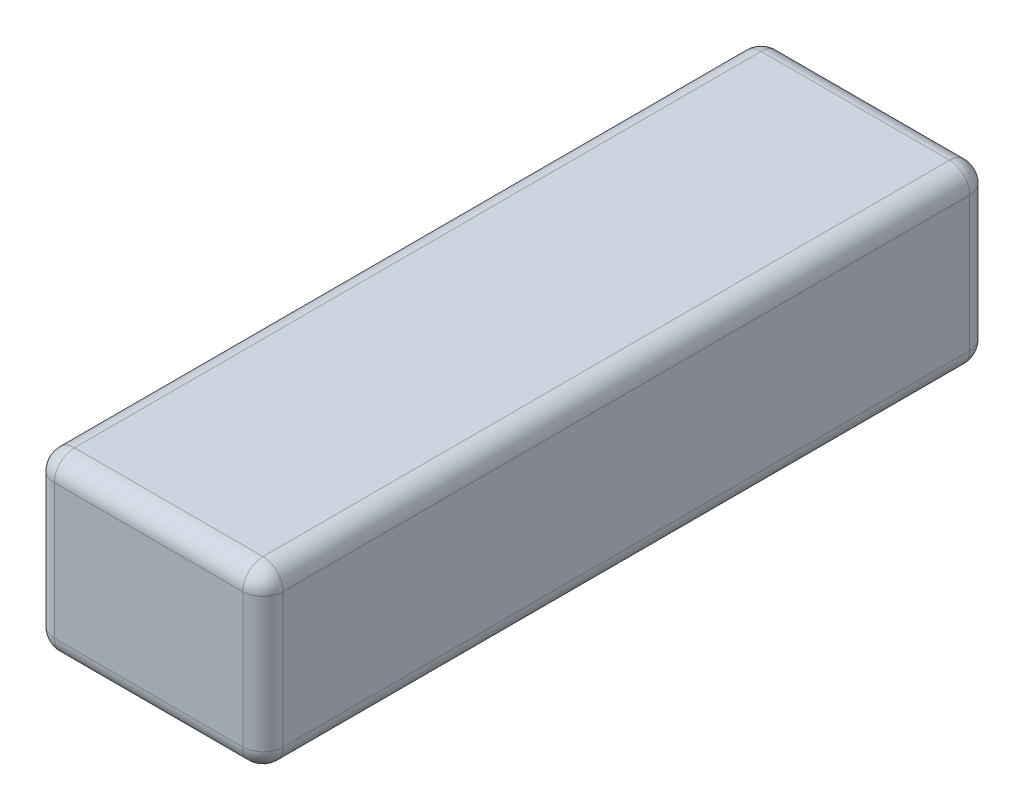
ISO-10303-21;
HEADER;
FILE_DESCRIPTION(('STEP AP214'),'2;1');
FILE_NAME('part.step','',(''),(''),'','','');
FILE_SCHEMA(('AUTOMOTIVE_DESIGN { 1 0 10303 214 1 1 1 1 }'));
ENDSEC;
DATA;
#1=APPLICATION_CONTEXT('core data for automotive mechanical design processes');
#2=APPLICATION_PROTOCOL_DEFINITION('international standard','automotive_design',2000,#1);
#3=PRODUCT_CONTEXT('',#1,'mechanical');
#4=PRODUCT('Part','Part','',(#3));
#5=PRODUCT_RELATED_PRODUCT_CATEGORY('part','',(#4));
#6=PRODUCT_DEFINITION_FORMATION('','',#4);
#7=PRODUCT_DEFINITION_CONTEXT('part definition',#1,'design');
#8=PRODUCT_DEFINITION('design','',#6,#7);
#9=PRODUCT_DEFINITION_SHAPE('','',#8);
#10=(LENGTH_UNIT() NAMED_UNIT(*) SI_UNIT(.MILLI.,.METRE.));
#11=(NAMED_UNIT(*) PLANE_ANGLE_UNIT() SI_UNIT($,.RADIAN.));
#12=(NAMED_UNIT(*) SI_UNIT($,.STERADIAN.) SOLID_ANGLE_UNIT());
#13=UNCERTAINTY_MEASURE_WITH_UNIT(LENGTH_MEASURE(1.E-05),#10,'distance_accuracy_value','');
#14=(GEOMETRIC_REPRESENTATION_CONTEXT(3) GLOBAL_UNCERTAINTY_ASSIGNED_CONTEXT((#13)) GLOBAL_UNIT_ASSIGNED_CONTEXT((#10,
#11,#12)) REPRESENTATION_CONTEXT('',''));
#15=CARTESIAN_POINT('',(0.,0.,0.));
#16=DIRECTION('',(0.,0.,1.));
#17=DIRECTION('',(1.,0.,0.));
#18=AXIS2_PLACEMENT_3D('',#15,#16,#17);
#19=CARTESIAN_POINT('',(17.,9.99999999999999,-51.));
#20=DIRECTION('',(-1.,0.,0.));
#21=DIRECTION('',(0.,0.,1.));
#22=AXIS2_PLACEMENT_3D('',#19,#20,#21);
#23=CYLINDRICAL_SURFACE('',#22,3.);
#24=DIRECTION('',(-1.,0.,0.));
#25=VECTOR('',#24,1.);
#26=CARTESIAN_POINT('',(17.,9.99999999999999,-54.));
#27=LINE('',#26,#25);
#28=CARTESIAN_POINT('',(14.,9.99999999999999,-54.));
#29=VERTEX_POINT('',#28);
#30=CARTESIAN_POINT('',(-14.,9.99999999999999,-54.));
#31=VERTEX_POINT('',#30);
#32=EDGE_CURVE('E227',#29,#31,#27,.T.);
#33=ORIENTED_EDGE('',*,*,#32,.T.);
#34=CARTESIAN_POINT('',(-14.,9.99999999999999,-51.));
#35=DIRECTION('',(-1.,0.,0.));
#36=DIRECTION('',(0.,0.,1.));
#37=AXIS2_PLACEMENT_3D('',#34,#35,#36);
#38=CIRCLE('',#37,3.);
#39=CARTESIAN_POINT('',(-14.,13.,-51.));
#40=VERTEX_POINT('',#39);
#41=EDGE_CURVE('E199',#31,#40,#38,.F.);
#42=ORIENTED_EDGE('',*,*,#41,.T.);
#43=DIRECTION('',(-1.,0.,0.));
#44=VECTOR('',#43,1.);
#45=CARTESIAN_POINT('',(17.,13.,-51.));
#46=LINE('',#45,#44);
#47=CARTESIAN_POINT('',(14.,13.,-51.));
#48=VERTEX_POINT('',#47);
#49=EDGE_CURVE('E147',#48,#40,#46,.T.);
#50=ORIENTED_EDGE('',*,*,#49,.F.);
#51=CARTESIAN_POINT('',(14.,9.99999999999999,-51.));
#52=DIRECTION('',(-1.,0.,0.));
#53=DIRECTION('',(0.,0.,1.));
#54=AXIS2_PLACEMENT_3D('',#51,#52,#53);
#55=CIRCLE('',#54,3.);
#56=EDGE_CURVE('E197',#48,#29,#55,.T.);
#57=ORIENTED_EDGE('',*,*,#56,.T.);
#58=EDGE_LOOP('',(#33,#42,#50,#57));
#59=FACE_BOUND('',#58,.T.);
#60=ADVANCED_FACE('F35',(#59),#23,.T.);
#61=CARTESIAN_POINT('',(17.,13.,51.));
#62=DIRECTION('',(0.,-1.,0.));
#63=DIRECTION('',(0.,0.,-1.));
#64=AXIS2_PLACEMENT_3D('',#61,#62,#63);
#65=PLANE('',#64);
#66=ORIENTED_EDGE('',*,*,#49,.T.);
#67=DIRECTION('',(0.,0.,1.));
#68=VECTOR('',#67,1.);
#69=CARTESIAN_POINT('',(-14.,13.,51.));
#70=LINE('',#69,#68);
#71=CARTESIAN_POINT('',(-14.,13.,51.));
#72=VERTEX_POINT('',#71);
#73=EDGE_CURVE('E146',#40,#72,#70,.T.);
#74=ORIENTED_EDGE('',*,*,#73,.T.);
#75=DIRECTION('',(-1.,0.,0.));
#76=VECTOR('',#75,1.);
#77=CARTESIAN_POINT('',(17.,13.,51.));
#78=LINE('',#77,#76);
#79=CARTESIAN_POINT('',(14.,13.,51.));
#80=VERTEX_POINT('',#79);
#81=EDGE_CURVE('E128',#80,#72,#78,.T.);
#82=ORIENTED_EDGE('',*,*,#81,.F.);
#83=DIRECTION('',(0.,0.,1.));
#84=VECTOR('',#83,1.);
#85=CARTESIAN_POINT('',(14.,13.,51.));
#86=LINE('',#85,#84);
#87=EDGE_CURVE('E143',#80,#48,#86,.F.);
#88=ORIENTED_EDGE('',*,*,#87,.T.);
#89=EDGE_LOOP('',(#66,#74,#82,#88));
#90=FACE_BOUND('',#89,.T.);
#91=ADVANCED_FACE('F141',(#90),#65,.F.);
#92=CARTESIAN_POINT('',(17.,9.99999999999999,51.));
#93=DIRECTION('',(-1.,0.,0.));
#94=DIRECTION('',(0.,0.,1.));
#95=AXIS2_PLACEMENT_3D('',#92,#93,#94);
#96=CYLINDRICAL_SURFACE('',#95,3.);
#97=ORIENTED_EDGE('',*,*,#81,.T.);
#98=CARTESIAN_POINT('',(-14.,9.99999999999999,51.));
#99=DIRECTION('',(-1.,0.,0.));
#100=DIRECTION('',(0.,0.,1.));
#101=AXIS2_PLACEMENT_3D('',#98,#99,#100);
#102=CIRCLE('',#101,3.);
#103=CARTESIAN_POINT('',(-14.,9.99999999999999,54.));
#104=VERTEX_POINT('',#103);
#105=EDGE_CURVE('E135',#72,#104,#102,.F.);
#106=ORIENTED_EDGE('',*,*,#105,.T.);
#107=DIRECTION('',(-1.,0.,0.));
#108=VECTOR('',#107,1.);
#109=CARTESIAN_POINT('',(17.,9.99999999999999,54.));
#110=LINE('',#109,#108);
#111=CARTESIAN_POINT('',(14.,9.99999999999999,54.));
#112=VERTEX_POINT('',#111);
#113=EDGE_CURVE('E130',#112,#104,#110,.T.);
#114=ORIENTED_EDGE('',*,*,#113,.F.);
#115=CARTESIAN_POINT('',(14.,9.99999999999999,51.));
#116=DIRECTION('',(-1.,0.,0.));
#117=DIRECTION('',(0.,0.,1.));
#118=AXIS2_PLACEMENT_3D('',#115,#116,#117);
#119=CIRCLE('',#118,3.);
#120=EDGE_CURVE('E125',#112,#80,#119,.T.);
#121=ORIENTED_EDGE('',*,*,#120,.T.);
#122=EDGE_LOOP('',(#97,#106,#114,#121));
#123=FACE_BOUND('',#122,.T.);
#124=ADVANCED_FACE('F127',(#123),#96,.T.);
#125=CARTESIAN_POINT('',(17.,9.99999999999999,54.));
#126=DIRECTION('',(0.,0.,-1.));
#127=DIRECTION('',(0.,1.,0.));
#128=AXIS2_PLACEMENT_3D('',#125,#126,#127);
#129=PLANE('',#128);
#130=ORIENTED_EDGE('',*,*,#113,.T.);
#131=DIRECTION('',(0.,-1.,0.));
#132=VECTOR('',#131,1.);
#133=CARTESIAN_POINT('',(-14.,-10.,54.));
#134=LINE('',#133,#132);
#135=CARTESIAN_POINT('',(-14.,-10.,54.));
#136=VERTEX_POINT('',#135);
#137=EDGE_CURVE('E178',#104,#136,#134,.T.);
#138=ORIENTED_EDGE('',*,*,#137,.T.);
#139=DIRECTION('',(-1.,0.,0.));
#140=VECTOR('',#139,1.);
#141=CARTESIAN_POINT('',(17.,-10.,54.));
#142=LINE('',#141,#140);
#143=CARTESIAN_POINT('',(14.,-10.,54.));
#144=VERTEX_POINT('',#143);
#145=EDGE_CURVE('E248',#144,#136,#142,.T.);
#146=ORIENTED_EDGE('',*,*,#145,.F.);
#147=DIRECTION('',(0.,-1.,0.));
#148=VECTOR('',#147,1.);
#149=CARTESIAN_POINT('',(14.,9.99999999999999,54.));
#150=LINE('',#149,#148);
#151=EDGE_CURVE('E176',#144,#112,#150,.F.);
#152=ORIENTED_EDGE('',*,*,#151,.T.);
#153=EDGE_LOOP('',(#130,#138,#146,#152));
#154=FACE_BOUND('',#153,.T.);
#155=ADVANCED_FACE('F245',(#154),#129,.F.);
#156=CARTESIAN_POINT('',(17.,-10.,51.));
#157=DIRECTION('',(-1.,0.,0.));
#158=DIRECTION('',(0.,0.,1.));
#159=AXIS2_PLACEMENT_3D('',#156,#157,#158);
#160=CYLINDRICAL_SURFACE('',#159,3.);
#161=ORIENTED_EDGE('',*,*,#145,.T.);
#162=CARTESIAN_POINT('',(-14.,-10.,51.));
#163=DIRECTION('',(-1.,0.,0.));
#164=DIRECTION('',(0.,0.,1.));
#165=AXIS2_PLACEMENT_3D('',#162,#163,#164);
#166=CIRCLE('',#165,3.);
#167=CARTESIAN_POINT('',(-14.,-13.,51.));
#168=VERTEX_POINT('',#167);
#169=EDGE_CURVE('E182',#136,#168,#166,.F.);
#170=ORIENTED_EDGE('',*,*,#169,.T.);
#171=DIRECTION('',(-1.,0.,0.));
#172=VECTOR('',#171,1.);
#173=CARTESIAN_POINT('',(17.,-13.,51.));
#174=LINE('',#173,#172);
#175=CARTESIAN_POINT('',(14.,-13.,51.));
#176=VERTEX_POINT('',#175);
#177=EDGE_CURVE('E251',#176,#168,#174,.T.);
#178=ORIENTED_EDGE('',*,*,#177,.F.);
#179=CARTESIAN_POINT('',(14.,-10.,51.));
#180=DIRECTION('',(-1.,0.,0.));
#181=DIRECTION('',(0.,0.,1.));
#182=AXIS2_PLACEMENT_3D('',#179,#180,#181);
#183=CIRCLE('',#182,3.);
#184=EDGE_CURVE('E180',#176,#144,#183,.T.);
#185=ORIENTED_EDGE('',*,*,#184,.T.);
#186=EDGE_LOOP('',(#161,#170,#178,#185));
#187=FACE_BOUND('',#186,.T.);
#188=ADVANCED_FACE('F293',(#187),#160,.T.);
#189=CARTESIAN_POINT('',(17.,-13.,51.));
#190=DIRECTION('',(0.,1.,0.));
#191=DIRECTION('',(0.,0.,1.));
#192=AXIS2_PLACEMENT_3D('',#189,#190,#191);
#193=PLANE('',#192);
#194=ORIENTED_EDGE('',*,*,#177,.T.);
#195=DIRECTION('',(0.,0.,-1.));
#196=VECTOR('',#195,1.);
#197=CARTESIAN_POINT('',(-14.,-13.,-51.));
#198=LINE('',#197,#196);
#199=CARTESIAN_POINT('',(-14.,-13.,-51.));
#200=VERTEX_POINT('',#199);
#201=EDGE_CURVE('E186',#168,#200,#198,.T.);
#202=ORIENTED_EDGE('',*,*,#201,.T.);
#203=DIRECTION('',(-1.,0.,0.));
#204=VECTOR('',#203,1.);
#205=CARTESIAN_POINT('',(17.,-13.,-51.));
#206=LINE('',#205,#204);
#207=CARTESIAN_POINT('',(14.,-13.,-51.));
#208=VERTEX_POINT('',#207);
#209=EDGE_CURVE('E255',#208,#200,#206,.T.);
#210=ORIENTED_EDGE('',*,*,#209,.F.);
#211=DIRECTION('',(0.,0.,-1.));
#212=VECTOR('',#211,1.);
#213=CARTESIAN_POINT('',(14.,-13.,51.));
#214=LINE('',#213,#212);
#215=EDGE_CURVE('E184',#208,#176,#214,.F.);
#216=ORIENTED_EDGE('',*,*,#215,.T.);
#217=EDGE_LOOP('',(#194,#202,#210,#216));
#218=FACE_BOUND('',#217,.T.);
#219=ADVANCED_FACE('F296',(#218),#193,.F.);
#220=CARTESIAN_POINT('',(17.,-10.,-51.));
#221=DIRECTION('',(-1.,0.,0.));
#222=DIRECTION('',(0.,0.,1.));
#223=AXIS2_PLACEMENT_3D('',#220,#221,#222);
#224=CYLINDRICAL_SURFACE('',#223,3.);
#225=ORIENTED_EDGE('',*,*,#209,.T.);
#226=CARTESIAN_POINT('',(-14.,-10.,-51.));
#227=DIRECTION('',(-1.,0.,0.));
#228=DIRECTION('',(0.,0.,1.));
#229=AXIS2_PLACEMENT_3D('',#226,#227,#228);
#230=CIRCLE('',#229,3.);
#231=CARTESIAN_POINT('',(-14.,-10.,-54.));
#232=VERTEX_POINT('',#231);
#233=EDGE_CURVE('E190',#200,#232,#230,.F.);
#234=ORIENTED_EDGE('',*,*,#233,.T.);
#235=DIRECTION('',(-1.,0.,0.));
#236=VECTOR('',#235,1.);
#237=CARTESIAN_POINT('',(17.,-10.,-54.));
#238=LINE('',#237,#236);
#239=CARTESIAN_POINT('',(14.,-10.,-54.));
#240=VERTEX_POINT('',#239);
#241=EDGE_CURVE('E260',#240,#232,#238,.T.);
#242=ORIENTED_EDGE('',*,*,#241,.F.);
#243=CARTESIAN_POINT('',(14.,-10.,-51.));
#244=DIRECTION('',(-1.,0.,0.));
#245=DIRECTION('',(0.,0.,1.));
#246=AXIS2_PLACEMENT_3D('',#243,#244,#245);
#247=CIRCLE('',#246,3.);
#248=EDGE_CURVE('E188',#240,#208,#247,.T.);
#249=ORIENTED_EDGE('',*,*,#248,.T.);
#250=EDGE_LOOP('',(#225,#234,#242,#249));
#251=FACE_BOUND('',#250,.T.);
#252=ADVANCED_FACE('F309',(#251),#224,.T.);
#253=CARTESIAN_POINT('',(17.,9.99999999999999,-54.));
#254=DIRECTION('',(0.,0.,1.));
#255=DIRECTION('',(0.,-1.,0.));
#256=AXIS2_PLACEMENT_3D('',#253,#254,#255);
#257=PLANE('',#256);
#258=ORIENTED_EDGE('',*,*,#241,.T.);
#259=DIRECTION('',(0.,1.,0.));
#260=VECTOR('',#259,1.);
#261=CARTESIAN_POINT('',(-14.,9.99999999999999,-54.));
#262=LINE('',#261,#260);
#263=EDGE_CURVE('E195',#232,#31,#262,.T.);
#264=ORIENTED_EDGE('',*,*,#263,.T.);
#265=ORIENTED_EDGE('',*,*,#32,.F.);
#266=DIRECTION('',(0.,1.,0.));
#267=VECTOR('',#266,1.);
#268=CARTESIAN_POINT('',(14.,9.99999999999999,-54.));
#269=LINE('',#268,#267);
#270=EDGE_CURVE('E192',#29,#240,#269,.F.);
#271=ORIENTED_EDGE('',*,*,#270,.T.);
#272=EDGE_LOOP('',(#258,#264,#265,#271));
#273=FACE_BOUND('',#272,.T.);
#274=ADVANCED_FACE('F310',(#273),#257,.F.);
#275=CARTESIAN_POINT('',(17.,9.99999999999999,-51.));
#276=DIRECTION('',(-1.,0.,0.));
#277=DIRECTION('',(0.,0.,1.));
#278=AXIS2_PLACEMENT_3D('',#275,#276,#277);
#279=PLANE('',#278);
#280=DIRECTION('',(0.,0.,-1.));
#281=VECTOR('',#280,1.);
#282=CARTESIAN_POINT('',(17.,-10.,-51.));
#283=LINE('',#282,#281);
#284=CARTESIAN_POINT('',(17.,-10.,51.));
#285=VERTEX_POINT('',#284);
#286=CARTESIAN_POINT('',(17.,-10.,-51.));
#287=VERTEX_POINT('',#286);
#288=EDGE_CURVE('E44',#285,#287,#283,.T.);
#289=ORIENTED_EDGE('',*,*,#288,.T.);
#290=DIRECTION('',(0.,1.,0.));
#291=VECTOR('',#290,1.);
#292=CARTESIAN_POINT('',(17.,9.99999999999999,-51.));
#293=LINE('',#292,#291);
#294=CARTESIAN_POINT('',(17.,9.99999999999999,-51.));
#295=VERTEX_POINT('',#294);
#296=EDGE_CURVE('E11',#287,#295,#293,.T.);
#297=ORIENTED_EDGE('',*,*,#296,.T.);
#298=DIRECTION('',(0.,0.,1.));
#299=VECTOR('',#298,1.);
#300=CARTESIAN_POINT('',(17.,9.99999999999999,-51.));
#301=LINE('',#300,#299);
#302=CARTESIAN_POINT('',(17.,9.99999999999999,51.));
#303=VERTEX_POINT('',#302);
#304=EDGE_CURVE('E201',#295,#303,#301,.T.);
#305=ORIENTED_EDGE('',*,*,#304,.T.);
#306=DIRECTION('',(0.,-1.,0.));
#307=VECTOR('',#306,1.);
#308=CARTESIAN_POINT('',(17.,9.99999999999996,51.));
#309=LINE('',#308,#307);
#310=EDGE_CURVE('E55',#303,#285,#309,.T.);
#311=ORIENTED_EDGE('',*,*,#310,.T.);
#312=EDGE_LOOP('',(#289,#297,#305,#311));
#313=FACE_BOUND('',#312,.T.);
#314=ADVANCED_FACE('F319',(#313),#279,.F.);
#315=CARTESIAN_POINT('',(-17.,9.99999999999999,-51.));
#316=DIRECTION('',(-1.,0.,0.));
#317=DIRECTION('',(0.,0.,1.));
#318=AXIS2_PLACEMENT_3D('',#315,#316,#317);
#319=PLANE('',#318);
#320=DIRECTION('',(0.,-1.,0.));
#321=VECTOR('',#320,1.);
#322=CARTESIAN_POINT('',(-17.,9.99999999999999,51.));
#323=LINE('',#322,#321);
#324=CARTESIAN_POINT('',(-17.,-10.,51.));
#325=VERTEX_POINT('',#324);
#326=CARTESIAN_POINT('',(-17.,9.99999999999999,51.));
#327=VERTEX_POINT('',#326);
#328=EDGE_CURVE('E171',#325,#327,#323,.F.);
#329=ORIENTED_EDGE('',*,*,#328,.T.);
#330=DIRECTION('',(0.,0.,1.));
#331=VECTOR('',#330,1.);
#332=CARTESIAN_POINT('',(-17.,9.99999999999999,-51.));
#333=LINE('',#332,#331);
#334=CARTESIAN_POINT('',(-17.,9.99999999999999,-51.));
#335=VERTEX_POINT('',#334);
#336=EDGE_CURVE('E136',#327,#335,#333,.F.);
#337=ORIENTED_EDGE('',*,*,#336,.T.);
#338=DIRECTION('',(0.,1.,0.));
#339=VECTOR('',#338,1.);
#340=CARTESIAN_POINT('',(-17.,-10.,-51.));
#341=LINE('',#340,#339);
#342=CARTESIAN_POINT('',(-17.,-10.,-51.));
#343=VERTEX_POINT('',#342);
#344=EDGE_CURVE('E164',#335,#343,#341,.F.);
#345=ORIENTED_EDGE('',*,*,#344,.T.);
#346=DIRECTION('',(0.,0.,-1.));
#347=VECTOR('',#346,1.);
#348=CARTESIAN_POINT('',(-17.,-10.,51.));
#349=LINE('',#348,#347);
#350=EDGE_CURVE('E169',#343,#325,#349,.F.);
#351=ORIENTED_EDGE('',*,*,#350,.T.);
#352=EDGE_LOOP('',(#329,#337,#345,#351));
#353=FACE_BOUND('',#352,.T.);
#354=ADVANCED_FACE('F321',(#353),#319,.T.);
#355=CARTESIAN_POINT('',(-14.,-10.,51.));
#356=DIRECTION('',(0.,0.,1.));
#357=DIRECTION('',(1.,0.,0.));
#358=AXIS2_PLACEMENT_3D('',#355,#356,#357);
#359=CYLINDRICAL_SURFACE('',#358,3.);
#360=CARTESIAN_POINT('',(-14.,-10.,-51.));
#361=DIRECTION('',(0.,0.,-1.));
#362=DIRECTION('',(-1.,0.,0.));
#363=AXIS2_PLACEMENT_3D('',#360,#361,#362);
#364=CIRCLE('',#363,3.);
#365=EDGE_CURVE('E224',#200,#343,#364,.T.);
#366=ORIENTED_EDGE('',*,*,#365,.F.);
#367=ORIENTED_EDGE('',*,*,#201,.F.);
#368=CARTESIAN_POINT('',(-14.,-10.,51.));
#369=DIRECTION('',(0.,0.,1.));
#370=DIRECTION('',(1.,0.,0.));
#371=AXIS2_PLACEMENT_3D('',#368,#369,#370);
#372=CIRCLE('',#371,3.);
#373=EDGE_CURVE('E221',#325,#168,#372,.T.);
#374=ORIENTED_EDGE('',*,*,#373,.F.);
#375=ORIENTED_EDGE('',*,*,#350,.F.);
#376=EDGE_LOOP('',(#366,#367,#374,#375));
#377=FACE_BOUND('',#376,.T.);
#378=ADVANCED_FACE('F301',(#377),#359,.T.);
#379=CARTESIAN_POINT('',(-14.,-10.,-51.));
#380=DIRECTION('',(0.,0.,1.));
#381=DIRECTION('',(1.,0.,0.));
#382=AXIS2_PLACEMENT_3D('',#379,#380,#381);
#383=SPHERICAL_SURFACE('',#382,3.);
#384=ORIENTED_EDGE('',*,*,#233,.F.);
#385=ORIENTED_EDGE('',*,*,#365,.T.);
#386=CARTESIAN_POINT('',(-14.,-10.,-51.));
#387=DIRECTION('',(0.,1.,0.));
#388=DIRECTION('',(0.,0.,1.));
#389=AXIS2_PLACEMENT_3D('',#386,#387,#388);
#390=CIRCLE('',#389,3.);
#391=EDGE_CURVE('E218',#232,#343,#390,.T.);
#392=ORIENTED_EDGE('',*,*,#391,.F.);
#393=EDGE_LOOP('',(#384,#385,#392));
#394=FACE_BOUND('',#393,.T.);
#395=ADVANCED_FACE('F306',(#394),#383,.T.);
#396=CARTESIAN_POINT('',(-14.,-10.,51.));
#397=DIRECTION('',(0.,0.,1.));
#398=DIRECTION('',(1.,0.,0.));
#399=AXIS2_PLACEMENT_3D('',#396,#397,#398);
#400=SPHERICAL_SURFACE('',#399,3.);
#401=ORIENTED_EDGE('',*,*,#373,.T.);
#402=ORIENTED_EDGE('',*,*,#169,.F.);
#403=CARTESIAN_POINT('',(-14.,-10.,51.));
#404=DIRECTION('',(0.,1.,0.));
#405=DIRECTION('',(0.,0.,1.));
#406=AXIS2_PLACEMENT_3D('',#403,#404,#405);
#407=CIRCLE('',#406,3.);
#408=EDGE_CURVE('E215',#325,#136,#407,.T.);
#409=ORIENTED_EDGE('',*,*,#408,.F.);
#410=EDGE_LOOP('',(#401,#402,#409));
#411=FACE_BOUND('',#410,.T.);
#412=ADVANCED_FACE('F290',(#411),#400,.T.);
#413=CARTESIAN_POINT('',(-14.,9.99999999999999,-51.));
#414=DIRECTION('',(0.,-1.,0.));
#415=DIRECTION('',(0.,0.,-1.));
#416=AXIS2_PLACEMENT_3D('',#413,#414,#415);
#417=CYLINDRICAL_SURFACE('',#416,3.);
#418=ORIENTED_EDGE('',*,*,#391,.T.);
#419=ORIENTED_EDGE('',*,*,#344,.F.);
#420=CARTESIAN_POINT('',(-14.,9.99999999999999,-51.));
#421=DIRECTION('',(0.,1.,0.));
#422=DIRECTION('',(0.,0.,1.));
#423=AXIS2_PLACEMENT_3D('',#420,#421,#422);
#424=CIRCLE('',#423,3.);
#425=EDGE_CURVE('E212',#31,#335,#424,.T.);
#426=ORIENTED_EDGE('',*,*,#425,.F.);
#427=ORIENTED_EDGE('',*,*,#263,.F.);
#428=EDGE_LOOP('',(#418,#419,#426,#427));
#429=FACE_BOUND('',#428,.T.);
#430=ADVANCED_FACE('F273',(#429),#417,.T.);
#431=CARTESIAN_POINT('',(-14.,9.99999999999999,51.));
#432=DIRECTION('',(0.,1.,0.));
#433=DIRECTION('',(0.,0.,1.));
#434=AXIS2_PLACEMENT_3D('',#431,#432,#433);
#435=CYLINDRICAL_SURFACE('',#434,3.);
#436=ORIENTED_EDGE('',*,*,#408,.T.);
#437=ORIENTED_EDGE('',*,*,#137,.F.);
#438=CARTESIAN_POINT('',(-14.,9.99999999999999,51.));
#439=DIRECTION('',(0.,1.,0.));
#440=DIRECTION('',(0.,0.,1.));
#441=AXIS2_PLACEMENT_3D('',#438,#439,#440);
#442=CIRCLE('',#441,3.);
#443=EDGE_CURVE('E209',#327,#104,#442,.T.);
#444=ORIENTED_EDGE('',*,*,#443,.F.);
#445=ORIENTED_EDGE('',*,*,#328,.F.);
#446=EDGE_LOOP('',(#436,#437,#444,#445));
#447=FACE_BOUND('',#446,.T.);
#448=ADVANCED_FACE('F287',(#447),#435,.T.);
#449=CARTESIAN_POINT('',(-14.,9.99999999999999,-51.));
#450=DIRECTION('',(0.,0.,1.));
#451=DIRECTION('',(1.,0.,0.));
#452=AXIS2_PLACEMENT_3D('',#449,#450,#451);
#453=SPHERICAL_SURFACE('',#452,3.);
#454=ORIENTED_EDGE('',*,*,#41,.F.);
#455=ORIENTED_EDGE('',*,*,#425,.T.);
#456=CARTESIAN_POINT('',(-14.,9.99999999999999,-51.));
#457=DIRECTION('',(0.,0.,1.));
#458=DIRECTION('',(1.,0.,0.));
#459=AXIS2_PLACEMENT_3D('',#456,#457,#458);
#460=CIRCLE('',#459,3.);
#461=EDGE_CURVE('E207',#40,#335,#460,.T.);
#462=ORIENTED_EDGE('',*,*,#461,.F.);
#463=EDGE_LOOP('',(#454,#455,#462));
#464=FACE_BOUND('',#463,.T.);
#465=ADVANCED_FACE('F276',(#464),#453,.T.);
#466=CARTESIAN_POINT('',(-14.,9.99999999999999,51.));
#467=DIRECTION('',(0.,0.,1.));
#468=DIRECTION('',(1.,0.,0.));
#469=AXIS2_PLACEMENT_3D('',#466,#467,#468);
#470=SPHERICAL_SURFACE('',#469,3.);
#471=ORIENTED_EDGE('',*,*,#443,.T.);
#472=ORIENTED_EDGE('',*,*,#105,.F.);
#473=CARTESIAN_POINT('',(-14.,9.99999999999999,51.));
#474=DIRECTION('',(0.,0.,-1.));
#475=DIRECTION('',(-1.,0.,0.));
#476=AXIS2_PLACEMENT_3D('',#473,#474,#475);
#477=CIRCLE('',#476,3.);
#478=EDGE_CURVE('E205',#327,#72,#477,.T.);
#479=ORIENTED_EDGE('',*,*,#478,.F.);
#480=EDGE_LOOP('',(#471,#472,#479));
#481=FACE_BOUND('',#480,.T.);
#482=ADVANCED_FACE('F283',(#481),#470,.T.);
#483=CARTESIAN_POINT('',(-14.,9.99999999999999,51.));
#484=DIRECTION('',(0.,0.,-1.));
#485=DIRECTION('',(-1.,0.,0.));
#486=AXIS2_PLACEMENT_3D('',#483,#484,#485);
#487=CYLINDRICAL_SURFACE('',#486,3.);
#488=ORIENTED_EDGE('',*,*,#461,.T.);
#489=ORIENTED_EDGE('',*,*,#336,.F.);
#490=ORIENTED_EDGE('',*,*,#478,.T.);
#491=ORIENTED_EDGE('',*,*,#73,.F.);
#492=EDGE_LOOP('',(#488,#489,#490,#491));
#493=FACE_BOUND('',#492,.T.);
#494=ADVANCED_FACE('F279',(#493),#487,.T.);
#495=CARTESIAN_POINT('',(14.,9.99999999999996,51.));
#496=DIRECTION('',(0.,-1.,0.));
#497=DIRECTION('',(0.,0.,-1.));
#498=AXIS2_PLACEMENT_3D('',#495,#496,#497);
#499=CYLINDRICAL_SURFACE('',#498,3.);
#500=CARTESIAN_POINT('',(14.,9.99999999999999,51.));
#501=DIRECTION('',(0.,1.,0.));
#502=DIRECTION('',(0.,0.,1.));
#503=AXIS2_PLACEMENT_3D('',#500,#501,#502);
#504=CIRCLE('',#503,3.);
#505=EDGE_CURVE('E152',#112,#303,#504,.T.);
#506=ORIENTED_EDGE('',*,*,#505,.F.);
#507=ORIENTED_EDGE('',*,*,#151,.F.);
#508=CARTESIAN_POINT('',(14.,-10.,51.));
#509=DIRECTION('',(0.,-1.,0.));
#510=DIRECTION('',(0.,0.,-1.));
#511=AXIS2_PLACEMENT_3D('',#508,#509,#510);
#512=CIRCLE('',#511,3.);
#513=EDGE_CURVE('E39',#285,#144,#512,.T.);
#514=ORIENTED_EDGE('',*,*,#513,.F.);
#515=ORIENTED_EDGE('',*,*,#310,.F.);
#516=EDGE_LOOP('',(#506,#507,#514,#515));
#517=FACE_BOUND('',#516,.T.);
#518=ADVANCED_FACE('F37',(#517),#499,.T.);
#519=CARTESIAN_POINT('',(14.,-10.,51.));
#520=DIRECTION('',(0.,0.,1.));
#521=DIRECTION('',(1.,0.,0.));
#522=AXIS2_PLACEMENT_3D('',#519,#520,#521);
#523=SPHERICAL_SURFACE('',#522,3.);
#524=ORIENTED_EDGE('',*,*,#513,.T.);
#525=ORIENTED_EDGE('',*,*,#184,.F.);
#526=CARTESIAN_POINT('',(14.,-10.,51.));
#527=DIRECTION('',(0.,0.,-1.));
#528=DIRECTION('',(-1.,0.,0.));
#529=AXIS2_PLACEMENT_3D('',#526,#527,#528);
#530=CIRCLE('',#529,3.);
#531=EDGE_CURVE('E155',#285,#176,#530,.T.);
#532=ORIENTED_EDGE('',*,*,#531,.F.);
#533=EDGE_LOOP('',(#524,#525,#532));
#534=FACE_BOUND('',#533,.T.);
#535=ADVANCED_FACE('F240',(#534),#523,.T.);
#536=CARTESIAN_POINT('',(14.,9.99999999999999,51.));
#537=DIRECTION('',(0.,0.,1.));
#538=DIRECTION('',(1.,0.,0.));
#539=AXIS2_PLACEMENT_3D('',#536,#537,#538);
#540=SPHERICAL_SURFACE('',#539,3.);
#541=ORIENTED_EDGE('',*,*,#120,.F.);
#542=ORIENTED_EDGE('',*,*,#505,.T.);
#543=CARTESIAN_POINT('',(14.,9.99999999999999,51.));
#544=DIRECTION('',(0.,0.,-1.));
#545=DIRECTION('',(-1.,0.,0.));
#546=AXIS2_PLACEMENT_3D('',#543,#544,#545);
#547=CIRCLE('',#546,3.);
#548=EDGE_CURVE('E150',#80,#303,#547,.T.);
#549=ORIENTED_EDGE('',*,*,#548,.F.);
#550=EDGE_LOOP('',(#541,#542,#549));
#551=FACE_BOUND('',#550,.T.);
#552=ADVANCED_FACE('F151',(#551),#540,.T.);
#553=CARTESIAN_POINT('',(14.,-10.,-51.));
#554=DIRECTION('',(0.,0.,-1.));
#555=DIRECTION('',(-1.,0.,0.));
#556=AXIS2_PLACEMENT_3D('',#553,#554,#555);
#557=CYLINDRICAL_SURFACE('',#556,3.);
#558=ORIENTED_EDGE('',*,*,#531,.T.);
#559=ORIENTED_EDGE('',*,*,#215,.F.);
#560=CARTESIAN_POINT('',(14.,-10.,-51.));
#561=DIRECTION('',(0.,0.,-1.));
#562=DIRECTION('',(-1.,0.,0.));
#563=AXIS2_PLACEMENT_3D('',#560,#561,#562);
#564=CIRCLE('',#563,3.);
#565=EDGE_CURVE('E156',#287,#208,#564,.T.);
#566=ORIENTED_EDGE('',*,*,#565,.F.);
#567=ORIENTED_EDGE('',*,*,#288,.F.);
#568=EDGE_LOOP('',(#558,#559,#566,#567));
#569=FACE_BOUND('',#568,.T.);
#570=ADVANCED_FACE('F364',(#569),#557,.T.);
#571=CARTESIAN_POINT('',(14.,9.99999999999999,-51.));
#572=DIRECTION('',(0.,0.,1.));
#573=DIRECTION('',(1.,0.,0.));
#574=AXIS2_PLACEMENT_3D('',#571,#572,#573);
#575=CYLINDRICAL_SURFACE('',#574,3.);
#576=ORIENTED_EDGE('',*,*,#548,.T.);
#577=ORIENTED_EDGE('',*,*,#304,.F.);
#578=CARTESIAN_POINT('',(14.,9.99999999999999,-51.));
#579=DIRECTION('',(0.,0.,-1.));
#580=DIRECTION('',(-1.,0.,0.));
#581=AXIS2_PLACEMENT_3D('',#578,#579,#580);
#582=CIRCLE('',#581,3.);
#583=EDGE_CURVE('E161',#48,#295,#582,.T.);
#584=ORIENTED_EDGE('',*,*,#583,.F.);
#585=ORIENTED_EDGE('',*,*,#87,.F.);
#586=EDGE_LOOP('',(#576,#577,#584,#585));
#587=FACE_BOUND('',#586,.T.);
#588=ADVANCED_FACE('F159',(#587),#575,.T.);
#589=CARTESIAN_POINT('',(14.,-10.,-51.));
#590=DIRECTION('',(0.,0.,1.));
#591=DIRECTION('',(1.,0.,0.));
#592=AXIS2_PLACEMENT_3D('',#589,#590,#591);
#593=SPHERICAL_SURFACE('',#592,3.);
#594=ORIENTED_EDGE('',*,*,#565,.T.);
#595=ORIENTED_EDGE('',*,*,#248,.F.);
#596=CARTESIAN_POINT('',(14.,-10.,-51.));
#597=DIRECTION('',(0.,1.,0.));
#598=DIRECTION('',(0.,0.,1.));
#599=AXIS2_PLACEMENT_3D('',#596,#597,#598);
#600=CIRCLE('',#599,3.);
#601=EDGE_CURVE('E230',#287,#240,#600,.T.);
#602=ORIENTED_EDGE('',*,*,#601,.F.);
#603=EDGE_LOOP('',(#594,#595,#602));
#604=FACE_BOUND('',#603,.T.);
#605=ADVANCED_FACE('F358',(#604),#593,.T.);
#606=CARTESIAN_POINT('',(14.,9.99999999999999,-51.));
#607=DIRECTION('',(0.,0.,1.));
#608=DIRECTION('',(1.,0.,0.));
#609=AXIS2_PLACEMENT_3D('',#606,#607,#608);
#610=SPHERICAL_SURFACE('',#609,3.);
#611=ORIENTED_EDGE('',*,*,#56,.F.);
#612=ORIENTED_EDGE('',*,*,#583,.T.);
#613=CARTESIAN_POINT('',(14.,9.99999999999999,-51.));
#614=DIRECTION('',(0.,-1.,0.));
#615=DIRECTION('',(0.,0.,-1.));
#616=AXIS2_PLACEMENT_3D('',#613,#614,#615);
#617=CIRCLE('',#616,3.);
#618=EDGE_CURVE('E228',#29,#295,#617,.T.);
#619=ORIENTED_EDGE('',*,*,#618,.F.);
#620=EDGE_LOOP('',(#611,#612,#619));
#621=FACE_BOUND('',#620,.T.);
#622=ADVANCED_FACE('F318',(#621),#610,.T.);
#623=CARTESIAN_POINT('',(14.,9.99999999999999,-51.));
#624=DIRECTION('',(0.,1.,0.));
#625=DIRECTION('',(0.,0.,1.));
#626=AXIS2_PLACEMENT_3D('',#623,#624,#625);
#627=CYLINDRICAL_SURFACE('',#626,3.);
#628=ORIENTED_EDGE('',*,*,#601,.T.);
#629=ORIENTED_EDGE('',*,*,#270,.F.);
#630=ORIENTED_EDGE('',*,*,#618,.T.);
#631=ORIENTED_EDGE('',*,*,#296,.F.);
#632=EDGE_LOOP('',(#628,#629,#630,#631));
#633=FACE_BOUND('',#632,.T.);
#634=ADVANCED_FACE('F313',(#633),#627,.T.);
#635=CLOSED_SHELL('',(#60,#91,#124,#155,#188,#219,#252,#274,#314,#354,#378,#395,#412,#430,#448,
#465,#482,#494,#518,#535,#552,#570,#588,#605,#622,#634));
#636=MANIFOLD_SOLID_BREP('B2',#635);
#637=ADVANCED_BREP_SHAPE_REPRESENTATION('',(#18,#636),#14);
#638=SHAPE_DEFINITION_REPRESENTATION(#9,#637);
ENDSEC;
END-ISO-10303-21;
